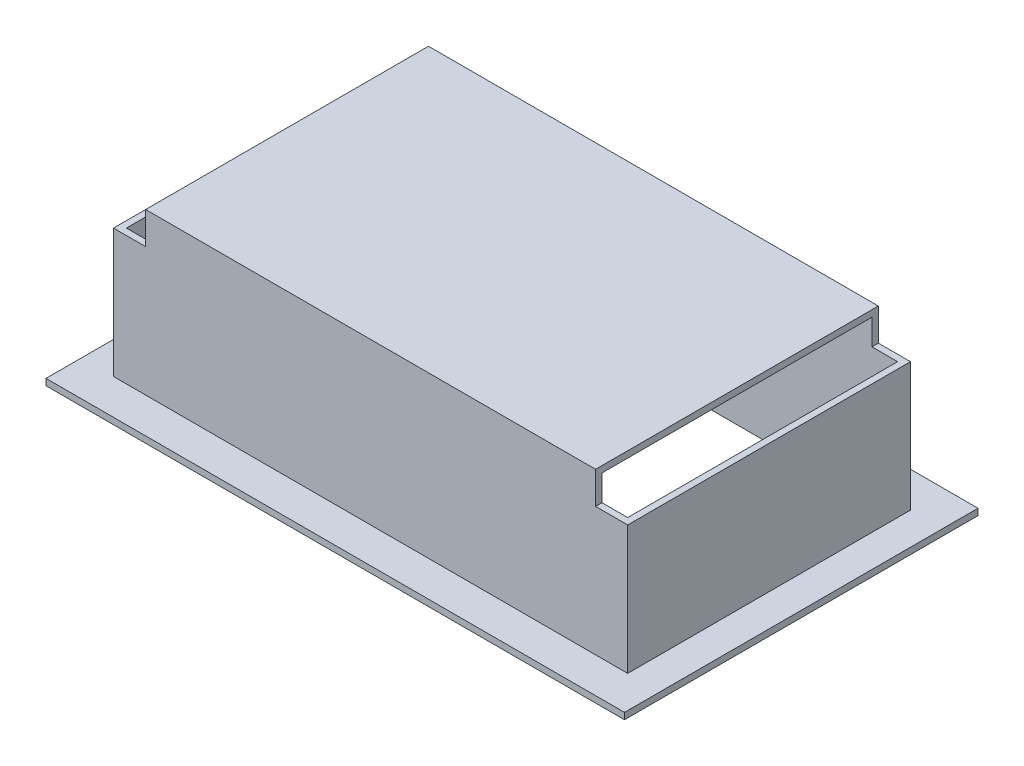
ISO-10303-21;
HEADER;
FILE_DESCRIPTION(('STEP AP214'),'2;1');
FILE_NAME('part.step','',(''),(''),'','','');
FILE_SCHEMA(('AUTOMOTIVE_DESIGN { 1 0 10303 214 1 1 1 1 }'));
ENDSEC;
DATA;
#1=APPLICATION_CONTEXT('core data for automotive mechanical design processes');
#2=APPLICATION_PROTOCOL_DEFINITION('international standard','automotive_design',2000,#1);
#3=PRODUCT_CONTEXT('',#1,'mechanical');
#4=PRODUCT('Part','Part','',(#3));
#5=PRODUCT_RELATED_PRODUCT_CATEGORY('part','',(#4));
#6=PRODUCT_DEFINITION_FORMATION('','',#4);
#7=PRODUCT_DEFINITION_CONTEXT('part definition',#1,'design');
#8=PRODUCT_DEFINITION('design','',#6,#7);
#9=PRODUCT_DEFINITION_SHAPE('','',#8);
#10=(LENGTH_UNIT() NAMED_UNIT(*) SI_UNIT(.MILLI.,.METRE.));
#11=(NAMED_UNIT(*) PLANE_ANGLE_UNIT() SI_UNIT($,.RADIAN.));
#12=(NAMED_UNIT(*) SI_UNIT($,.STERADIAN.) SOLID_ANGLE_UNIT());
#13=UNCERTAINTY_MEASURE_WITH_UNIT(LENGTH_MEASURE(1.E-05),#10,'distance_accuracy_value','');
#14=(GEOMETRIC_REPRESENTATION_CONTEXT(3) GLOBAL_UNCERTAINTY_ASSIGNED_CONTEXT((#13)) GLOBAL_UNIT_ASSIGNED_CONTEXT((#10,
#11,#12)) REPRESENTATION_CONTEXT('',''));
#15=CARTESIAN_POINT('',(0.,0.,0.));
#16=DIRECTION('',(0.,0.,1.));
#17=DIRECTION('',(1.,0.,0.));
#18=AXIS2_PLACEMENT_3D('',#15,#16,#17);
#19=CARTESIAN_POINT('',(-39.,25.,-21.));
#20=DIRECTION('',(1.,0.,0.));
#21=DIRECTION('',(0.,0.,-1.));
#22=AXIS2_PLACEMENT_3D('',#19,#20,#21);
#23=PLANE('',#22);
#24=DIRECTION('',(0.,-1.,0.));
#25=VECTOR('',#24,1.);
#26=CARTESIAN_POINT('',(-39.,25.,-21.));
#27=LINE('',#26,#25);
#28=CARTESIAN_POINT('',(-39.,21.,-21.));
#29=VERTEX_POINT('',#28);
#30=CARTESIAN_POINT('',(-39.,0.,-21.));
#31=VERTEX_POINT('',#30);
#32=EDGE_CURVE('E286',#29,#31,#27,.T.);
#33=ORIENTED_EDGE('',*,*,#32,.F.);
#34=DIRECTION('',(0.,0.,1.));
#35=VECTOR('',#34,1.);
#36=CARTESIAN_POINT('',(-39.,21.,-21.));
#37=LINE('',#36,#35);
#38=CARTESIAN_POINT('',(-39.,21.,21.));
#39=VERTEX_POINT('',#38);
#40=EDGE_CURVE('E361',#29,#39,#37,.T.);
#41=ORIENTED_EDGE('',*,*,#40,.T.);
#42=DIRECTION('',(0.,-1.,0.));
#43=VECTOR('',#42,1.);
#44=CARTESIAN_POINT('',(-39.,25.,21.));
#45=LINE('',#44,#43);
#46=CARTESIAN_POINT('',(-39.,0.,21.));
#47=VERTEX_POINT('',#46);
#48=EDGE_CURVE('E309',#39,#47,#45,.T.);
#49=ORIENTED_EDGE('',*,*,#48,.T.);
#50=DIRECTION('',(0.,0.,1.));
#51=VECTOR('',#50,1.);
#52=CARTESIAN_POINT('',(-39.,0.,-21.));
#53=LINE('',#52,#51);
#54=EDGE_CURVE('E268',#31,#47,#53,.T.);
#55=ORIENTED_EDGE('',*,*,#54,.F.);
#56=EDGE_LOOP('',(#33,#41,#49,#55));
#57=FACE_BOUND('',#56,.T.);
#58=ADVANCED_FACE('F43',(#57),#23,.T.);
#59=CARTESIAN_POINT('',(-40.,25.,-21.));
#60=DIRECTION('',(1.,0.,0.));
#61=DIRECTION('',(0.,0.,-1.));
#62=AXIS2_PLACEMENT_3D('',#59,#60,#61);
#63=PLANE('',#62);
#64=DIRECTION('',(0.,0.,1.));
#65=VECTOR('',#64,1.);
#66=CARTESIAN_POINT('',(-40.,21.,-22.));
#67=LINE('',#66,#65);
#68=CARTESIAN_POINT('',(-40.,21.,-22.));
#69=VERTEX_POINT('',#68);
#70=CARTESIAN_POINT('',(-40.,21.,22.));
#71=VERTEX_POINT('',#70);
#72=EDGE_CURVE('E184',#69,#71,#67,.T.);
#73=ORIENTED_EDGE('',*,*,#72,.F.);
#74=DIRECTION('',(0.,-1.,0.));
#75=VECTOR('',#74,1.);
#76=CARTESIAN_POINT('',(-40.,25.,-22.));
#77=LINE('',#76,#75);
#78=CARTESIAN_POINT('',(-40.,0.999999999999997,-22.));
#79=VERTEX_POINT('',#78);
#80=EDGE_CURVE('E211',#69,#79,#77,.T.);
#81=ORIENTED_EDGE('',*,*,#80,.T.);
#82=DIRECTION('',(0.,0.,-1.));
#83=VECTOR('',#82,1.);
#84=CARTESIAN_POINT('',(-40.,1.,22.));
#85=LINE('',#84,#83);
#86=CARTESIAN_POINT('',(-40.,0.999999999999997,22.));
#87=VERTEX_POINT('',#86);
#88=EDGE_CURVE('E209',#87,#79,#85,.T.);
#89=ORIENTED_EDGE('',*,*,#88,.F.);
#90=DIRECTION('',(0.,-1.,0.));
#91=VECTOR('',#90,1.);
#92=CARTESIAN_POINT('',(-40.,25.,22.));
#93=LINE('',#92,#91);
#94=EDGE_CURVE('E11',#71,#87,#93,.T.);
#95=ORIENTED_EDGE('',*,*,#94,.F.);
#96=EDGE_LOOP('',(#73,#81,#89,#95));
#97=FACE_BOUND('',#96,.T.);
#98=ADVANCED_FACE('F207',(#97),#63,.F.);
#99=CARTESIAN_POINT('',(0.,0.,0.));
#100=DIRECTION('',(0.,-1.,0.));
#101=DIRECTION('',(0.,0.,-1.));
#102=AXIS2_PLACEMENT_3D('',#99,#100,#101);
#103=PLANE('',#102);
#104=DIRECTION('',(-1.,0.,0.));
#105=VECTOR('',#104,1.);
#106=CARTESIAN_POINT('',(39.,0.,-21.));
#107=LINE('',#106,#105);
#108=CARTESIAN_POINT('',(39.,0.,-21.));
#109=VERTEX_POINT('',#108);
#110=EDGE_CURVE('E282',#109,#31,#107,.T.);
#111=ORIENTED_EDGE('',*,*,#110,.T.);
#112=ORIENTED_EDGE('',*,*,#54,.T.);
#113=DIRECTION('',(1.,0.,0.));
#114=VECTOR('',#113,1.);
#115=CARTESIAN_POINT('',(39.,0.,21.));
#116=LINE('',#115,#114);
#117=CARTESIAN_POINT('',(39.,0.,21.));
#118=VERTEX_POINT('',#117);
#119=EDGE_CURVE('E290',#47,#118,#116,.T.);
#120=ORIENTED_EDGE('',*,*,#119,.T.);
#121=DIRECTION('',(0.,0.,-1.));
#122=VECTOR('',#121,1.);
#123=CARTESIAN_POINT('',(39.,0.,-21.));
#124=LINE('',#123,#122);
#125=EDGE_CURVE('E294',#118,#109,#124,.T.);
#126=ORIENTED_EDGE('',*,*,#125,.T.);
#127=EDGE_LOOP('',(#111,#112,#120,#126));
#128=FACE_BOUND('',#127,.T.);
#129=DIRECTION('',(0.,0.,-1.));
#130=VECTOR('',#129,1.);
#131=CARTESIAN_POINT('',(-45.,0.,-27.5));
#132=LINE('',#131,#130);
#133=CARTESIAN_POINT('',(-45.,0.,27.5));
#134=VERTEX_POINT('',#133);
#135=CARTESIAN_POINT('',(-45.,0.,-27.5));
#136=VERTEX_POINT('',#135);
#137=EDGE_CURVE('E227',#134,#136,#132,.T.);
#138=ORIENTED_EDGE('',*,*,#137,.T.);
#139=DIRECTION('',(1.,0.,0.));
#140=VECTOR('',#139,1.);
#141=CARTESIAN_POINT('',(45.,0.,-27.5));
#142=LINE('',#141,#140);
#143=CARTESIAN_POINT('',(45.,0.,-27.5));
#144=VERTEX_POINT('',#143);
#145=EDGE_CURVE('E232',#136,#144,#142,.T.);
#146=ORIENTED_EDGE('',*,*,#145,.T.);
#147=DIRECTION('',(0.,0.,1.));
#148=VECTOR('',#147,1.);
#149=CARTESIAN_POINT('',(45.,0.,-27.5));
#150=LINE('',#149,#148);
#151=CARTESIAN_POINT('',(45.,0.,27.5));
#152=VERTEX_POINT('',#151);
#153=EDGE_CURVE('E258',#144,#152,#150,.T.);
#154=ORIENTED_EDGE('',*,*,#153,.T.);
#155=DIRECTION('',(-1.,0.,0.));
#156=VECTOR('',#155,1.);
#157=CARTESIAN_POINT('',(45.,0.,27.5));
#158=LINE('',#157,#156);
#159=EDGE_CURVE('E242',#152,#134,#158,.T.);
#160=ORIENTED_EDGE('',*,*,#159,.T.);
#161=EDGE_LOOP('',(#138,#146,#154,#160));
#162=FACE_BOUND('',#161,.T.);
#163=ADVANCED_FACE('F442',(#128,#162),#103,.T.);
#164=CARTESIAN_POINT('',(39.,25.,21.));
#165=DIRECTION('',(0.,0.,-1.));
#166=DIRECTION('',(-1.,0.,0.));
#167=AXIS2_PLACEMENT_3D('',#164,#165,#166);
#168=PLANE('',#167);
#169=DIRECTION('',(0.,-1.,0.));
#170=VECTOR('',#169,1.);
#171=CARTESIAN_POINT('',(-35.,25.,21.));
#172=LINE('',#171,#170);
#173=CARTESIAN_POINT('',(-35.,25.,21.));
#174=VERTEX_POINT('',#173);
#175=CARTESIAN_POINT('',(-35.,21.,21.));
#176=VERTEX_POINT('',#175);
#177=EDGE_CURVE('E217',#174,#176,#172,.T.);
#178=ORIENTED_EDGE('',*,*,#177,.F.);
#179=DIRECTION('',(1.,0.,0.));
#180=VECTOR('',#179,1.);
#181=CARTESIAN_POINT('',(39.,25.,21.));
#182=LINE('',#181,#180);
#183=CARTESIAN_POINT('',(35.,25.,21.));
#184=VERTEX_POINT('',#183);
#185=EDGE_CURVE('E277',#174,#184,#182,.T.);
#186=ORIENTED_EDGE('',*,*,#185,.T.);
#187=DIRECTION('',(0.,1.,0.));
#188=VECTOR('',#187,1.);
#189=CARTESIAN_POINT('',(35.,25.,21.));
#190=LINE('',#189,#188);
#191=CARTESIAN_POINT('',(35.,21.,21.));
#192=VERTEX_POINT('',#191);
#193=EDGE_CURVE('E61',#192,#184,#190,.T.);
#194=ORIENTED_EDGE('',*,*,#193,.F.);
#195=DIRECTION('',(-1.,0.,0.));
#196=VECTOR('',#195,1.);
#197=CARTESIAN_POINT('',(39.,21.,21.));
#198=LINE('',#197,#196);
#199=CARTESIAN_POINT('',(39.,21.,21.));
#200=VERTEX_POINT('',#199);
#201=EDGE_CURVE('E348',#200,#192,#198,.T.);
#202=ORIENTED_EDGE('',*,*,#201,.F.);
#203=DIRECTION('',(0.,-1.,0.));
#204=VECTOR('',#203,1.);
#205=CARTESIAN_POINT('',(39.,25.,21.));
#206=LINE('',#205,#204);
#207=EDGE_CURVE('E306',#200,#118,#206,.T.);
#208=ORIENTED_EDGE('',*,*,#207,.T.);
#209=ORIENTED_EDGE('',*,*,#119,.F.);
#210=ORIENTED_EDGE('',*,*,#48,.F.);
#211=DIRECTION('',(1.,0.,0.));
#212=VECTOR('',#211,1.);
#213=CARTESIAN_POINT('',(39.,21.,21.));
#214=LINE('',#213,#212);
#215=EDGE_CURVE('E357',#39,#176,#214,.T.);
#216=ORIENTED_EDGE('',*,*,#215,.T.);
#217=EDGE_LOOP('',(#178,#186,#194,#202,#208,#209,#210,#216));
#218=FACE_BOUND('',#217,.T.);
#219=ADVANCED_FACE('F422',(#218),#168,.T.);
#220=CARTESIAN_POINT('',(39.,25.,-21.));
#221=DIRECTION('',(-1.,0.,0.));
#222=DIRECTION('',(0.,0.,1.));
#223=AXIS2_PLACEMENT_3D('',#220,#221,#222);
#224=PLANE('',#223);
#225=DIRECTION('',(0.,0.,1.));
#226=VECTOR('',#225,1.);
#227=CARTESIAN_POINT('',(39.,21.,-21.));
#228=LINE('',#227,#226);
#229=CARTESIAN_POINT('',(39.,21.,-21.));
#230=VERTEX_POINT('',#229);
#231=EDGE_CURVE('E351',#230,#200,#228,.T.);
#232=ORIENTED_EDGE('',*,*,#231,.F.);
#233=DIRECTION('',(0.,-1.,0.));
#234=VECTOR('',#233,1.);
#235=CARTESIAN_POINT('',(39.,25.,-21.));
#236=LINE('',#235,#234);
#237=EDGE_CURVE('E303',#230,#109,#236,.T.);
#238=ORIENTED_EDGE('',*,*,#237,.T.);
#239=ORIENTED_EDGE('',*,*,#125,.F.);
#240=ORIENTED_EDGE('',*,*,#207,.F.);
#241=EDGE_LOOP('',(#232,#238,#239,#240));
#242=FACE_BOUND('',#241,.T.);
#243=ADVANCED_FACE('F436',(#242),#224,.T.);
#244=CARTESIAN_POINT('',(39.,25.,-21.));
#245=DIRECTION('',(0.,0.,1.));
#246=DIRECTION('',(1.,0.,0.));
#247=AXIS2_PLACEMENT_3D('',#244,#245,#246);
#248=PLANE('',#247);
#249=DIRECTION('',(0.,1.,0.));
#250=VECTOR('',#249,1.);
#251=CARTESIAN_POINT('',(-35.,25.,-21.));
#252=LINE('',#251,#250);
#253=CARTESIAN_POINT('',(-35.,21.,-21.));
#254=VERTEX_POINT('',#253);
#255=CARTESIAN_POINT('',(-35.,25.,-21.));
#256=VERTEX_POINT('',#255);
#257=EDGE_CURVE('E69',#254,#256,#252,.T.);
#258=ORIENTED_EDGE('',*,*,#257,.F.);
#259=DIRECTION('',(-1.,0.,0.));
#260=VECTOR('',#259,1.);
#261=CARTESIAN_POINT('',(39.,21.,-21.));
#262=LINE('',#261,#260);
#263=EDGE_CURVE('E365',#254,#29,#262,.T.);
#264=ORIENTED_EDGE('',*,*,#263,.T.);
#265=ORIENTED_EDGE('',*,*,#32,.T.);
#266=ORIENTED_EDGE('',*,*,#110,.F.);
#267=ORIENTED_EDGE('',*,*,#237,.F.);
#268=DIRECTION('',(1.,0.,0.));
#269=VECTOR('',#268,1.);
#270=CARTESIAN_POINT('',(39.,21.,-21.));
#271=LINE('',#270,#269);
#272=CARTESIAN_POINT('',(35.,21.,-21.));
#273=VERTEX_POINT('',#272);
#274=EDGE_CURVE('E354',#273,#230,#271,.T.);
#275=ORIENTED_EDGE('',*,*,#274,.F.);
#276=DIRECTION('',(0.,-1.,0.));
#277=VECTOR('',#276,1.);
#278=CARTESIAN_POINT('',(35.,25.,-21.));
#279=LINE('',#278,#277);
#280=CARTESIAN_POINT('',(35.,25.,-21.));
#281=VERTEX_POINT('',#280);
#282=EDGE_CURVE('E342',#281,#273,#279,.T.);
#283=ORIENTED_EDGE('',*,*,#282,.F.);
#284=DIRECTION('',(-1.,0.,0.));
#285=VECTOR('',#284,1.);
#286=CARTESIAN_POINT('',(39.,25.,-21.));
#287=LINE('',#286,#285);
#288=EDGE_CURVE('E281',#281,#256,#287,.T.);
#289=ORIENTED_EDGE('',*,*,#288,.T.);
#290=EDGE_LOOP('',(#258,#264,#265,#266,#267,#275,#283,#289));
#291=FACE_BOUND('',#290,.T.);
#292=ADVANCED_FACE('F431',(#291),#248,.T.);
#293=CARTESIAN_POINT('',(0.,25.,0.));
#294=DIRECTION('',(0.,-1.,0.));
#295=DIRECTION('',(0.,0.,-1.));
#296=AXIS2_PLACEMENT_3D('',#293,#294,#295);
#297=PLANE('',#296);
#298=DIRECTION('',(0.,0.,1.));
#299=VECTOR('',#298,1.);
#300=CARTESIAN_POINT('',(-35.,25.,0.));
#301=LINE('',#300,#299);
#302=EDGE_CURVE('E337',#256,#174,#301,.T.);
#303=ORIENTED_EDGE('',*,*,#302,.F.);
#304=ORIENTED_EDGE('',*,*,#288,.F.);
#305=DIRECTION('',(0.,0.,-1.));
#306=VECTOR('',#305,1.);
#307=CARTESIAN_POINT('',(35.,25.,0.));
#308=LINE('',#307,#306);
#309=EDGE_CURVE('E345',#184,#281,#308,.T.);
#310=ORIENTED_EDGE('',*,*,#309,.F.);
#311=ORIENTED_EDGE('',*,*,#185,.F.);
#312=EDGE_LOOP('',(#303,#304,#310,#311));
#313=FACE_BOUND('',#312,.T.);
#314=ADVANCED_FACE('F426',(#313),#297,.T.);
#315=CARTESIAN_POINT('',(-45.,1.,-27.5));
#316=DIRECTION('',(-1.,0.,0.));
#317=DIRECTION('',(0.,0.,1.));
#318=AXIS2_PLACEMENT_3D('',#315,#316,#317);
#319=PLANE('',#318);
#320=ORIENTED_EDGE('',*,*,#137,.F.);
#321=DIRECTION('',(0.,-1.,0.));
#322=VECTOR('',#321,1.);
#323=CARTESIAN_POINT('',(-45.,1.,27.5));
#324=LINE('',#323,#322);
#325=CARTESIAN_POINT('',(-45.,1.,27.5));
#326=VERTEX_POINT('',#325);
#327=EDGE_CURVE('E265',#326,#134,#324,.T.);
#328=ORIENTED_EDGE('',*,*,#327,.F.);
#329=DIRECTION('',(0.,0.,-1.));
#330=VECTOR('',#329,1.);
#331=CARTESIAN_POINT('',(-45.,1.,-27.5));
#332=LINE('',#331,#330);
#333=CARTESIAN_POINT('',(-45.,1.,-27.5));
#334=VERTEX_POINT('',#333);
#335=EDGE_CURVE('E237',#326,#334,#332,.T.);
#336=ORIENTED_EDGE('',*,*,#335,.T.);
#337=DIRECTION('',(0.,-1.,0.));
#338=VECTOR('',#337,1.);
#339=CARTESIAN_POINT('',(-45.,1.,-27.5));
#340=LINE('',#339,#338);
#341=EDGE_CURVE('E253',#334,#136,#340,.T.);
#342=ORIENTED_EDGE('',*,*,#341,.T.);
#343=EDGE_LOOP('',(#320,#328,#336,#342));
#344=FACE_BOUND('',#343,.T.);
#345=ADVANCED_FACE('F481',(#344),#319,.T.);
#346=CARTESIAN_POINT('',(45.,1.,27.5));
#347=DIRECTION('',(0.,0.,1.));
#348=DIRECTION('',(1.,0.,0.));
#349=AXIS2_PLACEMENT_3D('',#346,#347,#348);
#350=PLANE('',#349);
#351=ORIENTED_EDGE('',*,*,#159,.F.);
#352=DIRECTION('',(0.,-1.,0.));
#353=VECTOR('',#352,1.);
#354=CARTESIAN_POINT('',(45.,1.,27.5));
#355=LINE('',#354,#353);
#356=CARTESIAN_POINT('',(45.,1.,27.5));
#357=VERTEX_POINT('',#356);
#358=EDGE_CURVE('E269',#357,#152,#355,.T.);
#359=ORIENTED_EDGE('',*,*,#358,.F.);
#360=DIRECTION('',(-1.,0.,0.));
#361=VECTOR('',#360,1.);
#362=CARTESIAN_POINT('',(45.,1.,27.5));
#363=LINE('',#362,#361);
#364=EDGE_CURVE('E250',#357,#326,#363,.T.);
#365=ORIENTED_EDGE('',*,*,#364,.T.);
#366=ORIENTED_EDGE('',*,*,#327,.T.);
#367=EDGE_LOOP('',(#351,#359,#365,#366));
#368=FACE_BOUND('',#367,.T.);
#369=ADVANCED_FACE('F478',(#368),#350,.T.);
#370=CARTESIAN_POINT('',(45.,1.,-27.5));
#371=DIRECTION('',(1.,0.,0.));
#372=DIRECTION('',(0.,0.,-1.));
#373=AXIS2_PLACEMENT_3D('',#370,#371,#372);
#374=PLANE('',#373);
#375=ORIENTED_EDGE('',*,*,#153,.F.);
#376=DIRECTION('',(0.,-1.,0.));
#377=VECTOR('',#376,1.);
#378=CARTESIAN_POINT('',(45.,1.,-27.5));
#379=LINE('',#378,#377);
#380=CARTESIAN_POINT('',(45.,1.,-27.5));
#381=VERTEX_POINT('',#380);
#382=EDGE_CURVE('E272',#381,#144,#379,.T.);
#383=ORIENTED_EDGE('',*,*,#382,.F.);
#384=DIRECTION('',(0.,0.,1.));
#385=VECTOR('',#384,1.);
#386=CARTESIAN_POINT('',(45.,1.,-27.5));
#387=LINE('',#386,#385);
#388=EDGE_CURVE('E246',#381,#357,#387,.T.);
#389=ORIENTED_EDGE('',*,*,#388,.T.);
#390=ORIENTED_EDGE('',*,*,#358,.T.);
#391=EDGE_LOOP('',(#375,#383,#389,#390));
#392=FACE_BOUND('',#391,.T.);
#393=ADVANCED_FACE('F472',(#392),#374,.T.);
#394=CARTESIAN_POINT('',(45.,1.,-27.5));
#395=DIRECTION('',(0.,0.,-1.));
#396=DIRECTION('',(-1.,0.,0.));
#397=AXIS2_PLACEMENT_3D('',#394,#395,#396);
#398=PLANE('',#397);
#399=ORIENTED_EDGE('',*,*,#145,.F.);
#400=ORIENTED_EDGE('',*,*,#341,.F.);
#401=DIRECTION('',(1.,0.,0.));
#402=VECTOR('',#401,1.);
#403=CARTESIAN_POINT('',(45.,1.,-27.5));
#404=LINE('',#403,#402);
#405=EDGE_CURVE('E241',#334,#381,#404,.T.);
#406=ORIENTED_EDGE('',*,*,#405,.T.);
#407=ORIENTED_EDGE('',*,*,#382,.T.);
#408=EDGE_LOOP('',(#399,#400,#406,#407));
#409=FACE_BOUND('',#408,.T.);
#410=ADVANCED_FACE('F467',(#409),#398,.T.);
#411=CARTESIAN_POINT('',(0.,1.,0.));
#412=DIRECTION('',(0.,-1.,0.));
#413=DIRECTION('',(0.,0.,-1.));
#414=AXIS2_PLACEMENT_3D('',#411,#412,#413);
#415=PLANE('',#414);
#416=DIRECTION('',(-1.,0.,0.));
#417=VECTOR('',#416,1.);
#418=CARTESIAN_POINT('',(-40.,1.,22.));
#419=LINE('',#418,#417);
#420=CARTESIAN_POINT('',(40.,0.999999999999997,22.));
#421=VERTEX_POINT('',#420);
#422=EDGE_CURVE('E220',#421,#87,#419,.T.);
#423=ORIENTED_EDGE('',*,*,#422,.T.);
#424=ORIENTED_EDGE('',*,*,#88,.T.);
#425=DIRECTION('',(1.,0.,0.));
#426=VECTOR('',#425,1.);
#427=CARTESIAN_POINT('',(-40.,1.,-22.));
#428=LINE('',#427,#426);
#429=CARTESIAN_POINT('',(40.,1.,-22.));
#430=VERTEX_POINT('',#429);
#431=EDGE_CURVE('E216',#79,#430,#428,.T.);
#432=ORIENTED_EDGE('',*,*,#431,.T.);
#433=DIRECTION('',(0.,0.,1.));
#434=VECTOR('',#433,1.);
#435=CARTESIAN_POINT('',(40.,1.,22.));
#436=LINE('',#435,#434);
#437=EDGE_CURVE('E224',#430,#421,#436,.T.);
#438=ORIENTED_EDGE('',*,*,#437,.T.);
#439=EDGE_LOOP('',(#423,#424,#432,#438));
#440=FACE_BOUND('',#439,.T.);
#441=ORIENTED_EDGE('',*,*,#335,.F.);
#442=ORIENTED_EDGE('',*,*,#364,.F.);
#443=ORIENTED_EDGE('',*,*,#388,.F.);
#444=ORIENTED_EDGE('',*,*,#405,.F.);
#445=EDGE_LOOP('',(#441,#442,#443,#444));
#446=FACE_BOUND('',#445,.T.);
#447=ADVANCED_FACE('F221',(#440,#446),#415,.F.);
#448=CARTESIAN_POINT('',(0.,26.,0.));
#449=DIRECTION('',(0.,-1.,0.));
#450=DIRECTION('',(0.,0.,-1.));
#451=AXIS2_PLACEMENT_3D('',#448,#449,#450);
#452=PLANE('',#451);
#453=DIRECTION('',(-1.,0.,0.));
#454=VECTOR('',#453,1.);
#455=CARTESIAN_POINT('',(0.,26.,-22.));
#456=LINE('',#455,#454);
#457=CARTESIAN_POINT('',(35.,26.,-22.));
#458=VERTEX_POINT('',#457);
#459=CARTESIAN_POINT('',(-35.,26.,-22.));
#460=VERTEX_POINT('',#459);
#461=EDGE_CURVE('E47',#458,#460,#456,.T.);
#462=ORIENTED_EDGE('',*,*,#461,.T.);
#463=DIRECTION('',(0.,0.,-1.));
#464=VECTOR('',#463,1.);
#465=CARTESIAN_POINT('',(-35.,26.,-22.));
#466=LINE('',#465,#464);
#467=CARTESIAN_POINT('',(-35.,26.,22.));
#468=VERTEX_POINT('',#467);
#469=EDGE_CURVE('E196',#468,#460,#466,.T.);
#470=ORIENTED_EDGE('',*,*,#469,.F.);
#471=DIRECTION('',(1.,0.,0.));
#472=VECTOR('',#471,1.);
#473=CARTESIAN_POINT('',(0.,26.,22.));
#474=LINE('',#473,#472);
#475=CARTESIAN_POINT('',(35.,26.,22.));
#476=VERTEX_POINT('',#475);
#477=EDGE_CURVE('E311',#468,#476,#474,.T.);
#478=ORIENTED_EDGE('',*,*,#477,.T.);
#479=DIRECTION('',(0.,0.,1.));
#480=VECTOR('',#479,1.);
#481=CARTESIAN_POINT('',(35.,26.,-22.));
#482=LINE('',#481,#480);
#483=EDGE_CURVE('E373',#458,#476,#482,.T.);
#484=ORIENTED_EDGE('',*,*,#483,.F.);
#485=EDGE_LOOP('',(#462,#470,#478,#484));
#486=FACE_BOUND('',#485,.T.);
#487=ADVANCED_FACE('F45',(#486),#452,.F.);
#488=CARTESIAN_POINT('',(39.,25.,-22.));
#489=DIRECTION('',(0.,0.,1.));
#490=DIRECTION('',(1.,0.,0.));
#491=AXIS2_PLACEMENT_3D('',#488,#489,#490);
#492=PLANE('',#491);
#493=DIRECTION('',(-1.,0.,0.));
#494=VECTOR('',#493,1.);
#495=CARTESIAN_POINT('',(-40.,21.,-22.));
#496=LINE('',#495,#494);
#497=CARTESIAN_POINT('',(-35.,21.,-22.));
#498=VERTEX_POINT('',#497);
#499=EDGE_CURVE('E191',#498,#69,#496,.T.);
#500=ORIENTED_EDGE('',*,*,#499,.F.);
#501=DIRECTION('',(0.,1.,0.));
#502=VECTOR('',#501,1.);
#503=CARTESIAN_POINT('',(-35.,21.,-22.));
#504=LINE('',#503,#502);
#505=EDGE_CURVE('E369',#498,#460,#504,.T.);
#506=ORIENTED_EDGE('',*,*,#505,.T.);
#507=ORIENTED_EDGE('',*,*,#461,.F.);
#508=DIRECTION('',(0.,1.,0.));
#509=VECTOR('',#508,1.);
#510=CARTESIAN_POINT('',(35.,21.,-22.));
#511=LINE('',#510,#509);
#512=CARTESIAN_POINT('',(35.,21.,-22.));
#513=VERTEX_POINT('',#512);
#514=EDGE_CURVE('E384',#513,#458,#511,.T.);
#515=ORIENTED_EDGE('',*,*,#514,.F.);
#516=DIRECTION('',(-1.,0.,0.));
#517=VECTOR('',#516,1.);
#518=CARTESIAN_POINT('',(40.,21.,-22.));
#519=LINE('',#518,#517);
#520=CARTESIAN_POINT('',(40.,21.,-22.));
#521=VERTEX_POINT('',#520);
#522=EDGE_CURVE('E327',#521,#513,#519,.T.);
#523=ORIENTED_EDGE('',*,*,#522,.F.);
#524=DIRECTION('',(0.,-1.,0.));
#525=VECTOR('',#524,1.);
#526=CARTESIAN_POINT('',(40.,25.,-22.));
#527=LINE('',#526,#525);
#528=EDGE_CURVE('E315',#521,#430,#527,.T.);
#529=ORIENTED_EDGE('',*,*,#528,.T.);
#530=ORIENTED_EDGE('',*,*,#431,.F.);
#531=ORIENTED_EDGE('',*,*,#80,.F.);
#532=EDGE_LOOP('',(#500,#506,#507,#515,#523,#529,#530,#531));
#533=FACE_BOUND('',#532,.T.);
#534=ADVANCED_FACE('F324',(#533),#492,.F.);
#535=CARTESIAN_POINT('',(40.,25.,-21.));
#536=DIRECTION('',(-1.,0.,0.));
#537=DIRECTION('',(0.,0.,1.));
#538=AXIS2_PLACEMENT_3D('',#535,#536,#537);
#539=PLANE('',#538);
#540=ORIENTED_EDGE('',*,*,#528,.F.);
#541=DIRECTION('',(0.,0.,-1.));
#542=VECTOR('',#541,1.);
#543=CARTESIAN_POINT('',(40.,21.,-22.));
#544=LINE('',#543,#542);
#545=CARTESIAN_POINT('',(40.,21.,22.));
#546=VERTEX_POINT('',#545);
#547=EDGE_CURVE('E370',#546,#521,#544,.T.);
#548=ORIENTED_EDGE('',*,*,#547,.F.);
#549=DIRECTION('',(0.,-1.,0.));
#550=VECTOR('',#549,1.);
#551=CARTESIAN_POINT('',(40.,25.,22.));
#552=LINE('',#551,#550);
#553=EDGE_CURVE('E53',#546,#421,#552,.T.);
#554=ORIENTED_EDGE('',*,*,#553,.T.);
#555=ORIENTED_EDGE('',*,*,#437,.F.);
#556=EDGE_LOOP('',(#540,#548,#554,#555));
#557=FACE_BOUND('',#556,.T.);
#558=ADVANCED_FACE('F330',(#557),#539,.F.);
#559=CARTESIAN_POINT('',(39.,25.,22.));
#560=DIRECTION('',(0.,0.,-1.));
#561=DIRECTION('',(-1.,0.,0.));
#562=AXIS2_PLACEMENT_3D('',#559,#560,#561);
#563=PLANE('',#562);
#564=ORIENTED_EDGE('',*,*,#477,.F.);
#565=DIRECTION('',(0.,1.,0.));
#566=VECTOR('',#565,1.);
#567=CARTESIAN_POINT('',(-35.,21.,22.));
#568=LINE('',#567,#566);
#569=CARTESIAN_POINT('',(-35.,21.,22.));
#570=VERTEX_POINT('',#569);
#571=EDGE_CURVE('E203',#570,#468,#568,.T.);
#572=ORIENTED_EDGE('',*,*,#571,.F.);
#573=DIRECTION('',(1.,0.,0.));
#574=VECTOR('',#573,1.);
#575=CARTESIAN_POINT('',(-40.,21.,22.));
#576=LINE('',#575,#574);
#577=EDGE_CURVE('E188',#71,#570,#576,.T.);
#578=ORIENTED_EDGE('',*,*,#577,.F.);
#579=ORIENTED_EDGE('',*,*,#94,.T.);
#580=ORIENTED_EDGE('',*,*,#422,.F.);
#581=ORIENTED_EDGE('',*,*,#553,.F.);
#582=DIRECTION('',(1.,0.,0.));
#583=VECTOR('',#582,1.);
#584=CARTESIAN_POINT('',(40.,21.,22.));
#585=LINE('',#584,#583);
#586=CARTESIAN_POINT('',(35.,21.,22.));
#587=VERTEX_POINT('',#586);
#588=EDGE_CURVE('E381',#587,#546,#585,.T.);
#589=ORIENTED_EDGE('',*,*,#588,.F.);
#590=DIRECTION('',(0.,1.,0.));
#591=VECTOR('',#590,1.);
#592=CARTESIAN_POINT('',(35.,21.,22.));
#593=LINE('',#592,#591);
#594=EDGE_CURVE('E387',#587,#476,#593,.T.);
#595=ORIENTED_EDGE('',*,*,#594,.T.);
#596=EDGE_LOOP('',(#564,#572,#578,#579,#580,#581,#589,#595));
#597=FACE_BOUND('',#596,.T.);
#598=ADVANCED_FACE('F200',(#597),#563,.F.);
#599=CARTESIAN_POINT('',(-35.,21.,-22.));
#600=DIRECTION('',(1.,0.,0.));
#601=DIRECTION('',(0.,0.,-1.));
#602=AXIS2_PLACEMENT_3D('',#599,#600,#601);
#603=PLANE('',#602);
#604=ORIENTED_EDGE('',*,*,#177,.T.);
#605=DIRECTION('',(0.,0.,-1.));
#606=VECTOR('',#605,1.);
#607=CARTESIAN_POINT('',(-35.,21.,-22.));
#608=LINE('',#607,#606);
#609=EDGE_CURVE('E402',#570,#176,#608,.T.);
#610=ORIENTED_EDGE('',*,*,#609,.F.);
#611=ORIENTED_EDGE('',*,*,#571,.T.);
#612=ORIENTED_EDGE('',*,*,#469,.T.);
#613=ORIENTED_EDGE('',*,*,#505,.F.);
#614=EDGE_CURVE('E205',#254,#498,#608,.T.);
#615=ORIENTED_EDGE('',*,*,#614,.F.);
#616=ORIENTED_EDGE('',*,*,#257,.T.);
#617=ORIENTED_EDGE('',*,*,#302,.T.);
#618=EDGE_LOOP('',(#604,#610,#611,#612,#613,#615,#616,#617));
#619=FACE_BOUND('',#618,.T.);
#620=ADVANCED_FACE('F406',(#619),#603,.F.);
#621=CARTESIAN_POINT('',(0.,21.,0.));
#622=DIRECTION('',(0.,1.,0.));
#623=DIRECTION('',(0.,0.,1.));
#624=AXIS2_PLACEMENT_3D('',#621,#622,#623);
#625=PLANE('',#624);
#626=ORIENTED_EDGE('',*,*,#40,.F.);
#627=ORIENTED_EDGE('',*,*,#263,.F.);
#628=ORIENTED_EDGE('',*,*,#614,.T.);
#629=ORIENTED_EDGE('',*,*,#499,.T.);
#630=ORIENTED_EDGE('',*,*,#72,.T.);
#631=ORIENTED_EDGE('',*,*,#577,.T.);
#632=ORIENTED_EDGE('',*,*,#609,.T.);
#633=ORIENTED_EDGE('',*,*,#215,.F.);
#634=EDGE_LOOP('',(#626,#627,#628,#629,#630,#631,#632,#633));
#635=FACE_BOUND('',#634,.T.);
#636=ADVANCED_FACE('F186',(#635),#625,.T.);
#637=CARTESIAN_POINT('',(35.,21.,-22.));
#638=DIRECTION('',(-1.,0.,0.));
#639=DIRECTION('',(0.,0.,1.));
#640=AXIS2_PLACEMENT_3D('',#637,#638,#639);
#641=PLANE('',#640);
#642=ORIENTED_EDGE('',*,*,#193,.T.);
#643=ORIENTED_EDGE('',*,*,#309,.T.);
#644=ORIENTED_EDGE('',*,*,#282,.T.);
#645=DIRECTION('',(0.,0.,1.));
#646=VECTOR('',#645,1.);
#647=CARTESIAN_POINT('',(35.,21.,-22.));
#648=LINE('',#647,#646);
#649=EDGE_CURVE('E376',#513,#273,#648,.T.);
#650=ORIENTED_EDGE('',*,*,#649,.F.);
#651=ORIENTED_EDGE('',*,*,#514,.T.);
#652=ORIENTED_EDGE('',*,*,#483,.T.);
#653=ORIENTED_EDGE('',*,*,#594,.F.);
#654=EDGE_CURVE('E380',#192,#587,#648,.T.);
#655=ORIENTED_EDGE('',*,*,#654,.F.);
#656=EDGE_LOOP('',(#642,#643,#644,#650,#651,#652,#653,#655));
#657=FACE_BOUND('',#656,.T.);
#658=ADVANCED_FACE('F413',(#657),#641,.F.);
#659=CARTESIAN_POINT('',(0.,21.,0.));
#660=DIRECTION('',(0.,-1.,0.));
#661=DIRECTION('',(0.,0.,-1.));
#662=AXIS2_PLACEMENT_3D('',#659,#660,#661);
#663=PLANE('',#662);
#664=ORIENTED_EDGE('',*,*,#201,.T.);
#665=ORIENTED_EDGE('',*,*,#654,.T.);
#666=ORIENTED_EDGE('',*,*,#588,.T.);
#667=ORIENTED_EDGE('',*,*,#547,.T.);
#668=ORIENTED_EDGE('',*,*,#522,.T.);
#669=ORIENTED_EDGE('',*,*,#649,.T.);
#670=ORIENTED_EDGE('',*,*,#274,.T.);
#671=ORIENTED_EDGE('',*,*,#231,.T.);
#672=EDGE_LOOP('',(#664,#665,#666,#667,#668,#669,#670,#671));
#673=FACE_BOUND('',#672,.T.);
#674=ADVANCED_FACE('F417',(#673),#663,.F.);
#675=CLOSED_SHELL('',(#58,#98,#163,#219,#243,#292,#314,#345,#369,#393,#410,#447,#487,#534,#558,
#598,#620,#636,#658,#674));
#676=MANIFOLD_SOLID_BREP('B2',#675);
#677=ADVANCED_BREP_SHAPE_REPRESENTATION('',(#18,#676),#14);
#678=SHAPE_DEFINITION_REPRESENTATION(#9,#677);
ENDSEC;
END-ISO-10303-21;
